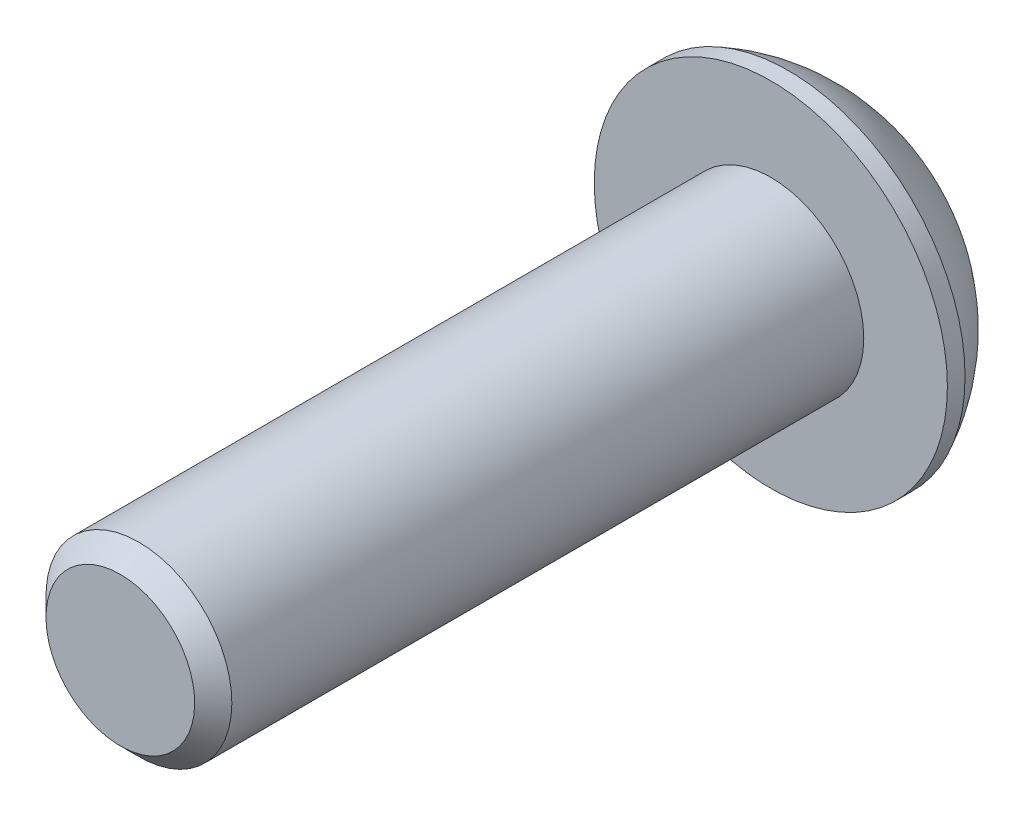
ISO-10303-21;
HEADER;
FILE_DESCRIPTION(('STEP AP214'),'2;1');
FILE_NAME('part.step','',(''),(''),'','','');
FILE_SCHEMA(('AUTOMOTIVE_DESIGN { 1 0 10303 214 1 1 1 1 }'));
ENDSEC;
DATA;
#1=APPLICATION_CONTEXT('core data for automotive mechanical design processes');
#2=APPLICATION_PROTOCOL_DEFINITION('international standard','automotive_design',2000,#1);
#3=PRODUCT_CONTEXT('',#1,'mechanical');
#4=PRODUCT('Part','Part','',(#3));
#5=PRODUCT_RELATED_PRODUCT_CATEGORY('part','',(#4));
#6=PRODUCT_DEFINITION_FORMATION('','',#4);
#7=PRODUCT_DEFINITION_CONTEXT('part definition',#1,'design');
#8=PRODUCT_DEFINITION('design','',#6,#7);
#9=PRODUCT_DEFINITION_SHAPE('','',#8);
#10=(LENGTH_UNIT() NAMED_UNIT(*) SI_UNIT(.MILLI.,.METRE.));
#11=(NAMED_UNIT(*) PLANE_ANGLE_UNIT() SI_UNIT($,.RADIAN.));
#12=(NAMED_UNIT(*) SI_UNIT($,.STERADIAN.) SOLID_ANGLE_UNIT());
#13=UNCERTAINTY_MEASURE_WITH_UNIT(LENGTH_MEASURE(1.E-05),#10,'distance_accuracy_value','');
#14=(GEOMETRIC_REPRESENTATION_CONTEXT(3) GLOBAL_UNCERTAINTY_ASSIGNED_CONTEXT((#13)) GLOBAL_UNIT_ASSIGNED_CONTEXT((#10,
#11,#12)) REPRESENTATION_CONTEXT('',''));
#15=CARTESIAN_POINT('',(0.,0.,0.));
#16=DIRECTION('',(0.,0.,1.));
#17=DIRECTION('',(1.,0.,0.));
#18=AXIS2_PLACEMENT_3D('',#15,#16,#17);
#19=CARTESIAN_POINT('',(0.,0.,-1.06));
#20=DIRECTION('',(0.,0.,1.));
#21=DIRECTION('',(1.,0.,0.));
#22=AXIS2_PLACEMENT_3D('',#19,#20,#21);
#23=PLANE('',#22);
#24=DIRECTION('',(-0.866025403784439,0.5,0.));
#25=VECTOR('',#24,1.);
#26=CARTESIAN_POINT('',(0.,1.44337567297406,-1.06));
#27=LINE('',#26,#25);
#28=CARTESIAN_POINT('',(0.,1.44337567297406,-1.06));
#29=VERTEX_POINT('',#28);
#30=CARTESIAN_POINT('',(1.25,0.721687836487031,-1.06));
#31=VERTEX_POINT('',#30);
#32=EDGE_CURVE('E70',#29,#31,#27,.F.);
#33=ORIENTED_EDGE('',*,*,#32,.T.);
#34=DIRECTION('',(0.,1.,0.));
#35=VECTOR('',#34,1.);
#36=CARTESIAN_POINT('',(1.25,0.721687836487032,-1.06));
#37=LINE('',#36,#35);
#38=CARTESIAN_POINT('',(1.25,-0.721687836487032,-1.06));
#39=VERTEX_POINT('',#38);
#40=EDGE_CURVE('E72',#31,#39,#37,.F.);
#41=ORIENTED_EDGE('',*,*,#40,.T.);
#42=DIRECTION('',(0.866025403784439,0.499999999999999,0.));
#43=VECTOR('',#42,1.);
#44=CARTESIAN_POINT('',(1.25,-0.721687836487032,-1.06));
#45=LINE('',#44,#43);
#46=CARTESIAN_POINT('',(0.,-1.44337567297406,-1.06));
#47=VERTEX_POINT('',#46);
#48=EDGE_CURVE('E125',#39,#47,#45,.F.);
#49=ORIENTED_EDGE('',*,*,#48,.T.);
#50=DIRECTION('',(0.866025403784438,-0.5,0.));
#51=VECTOR('',#50,1.);
#52=CARTESIAN_POINT('',(0.,-1.44337567297406,-1.06));
#53=LINE('',#52,#51);
#54=CARTESIAN_POINT('',(-1.25,-0.721687836487031,-1.06));
#55=VERTEX_POINT('',#54);
#56=EDGE_CURVE('E130',#47,#55,#53,.F.);
#57=ORIENTED_EDGE('',*,*,#56,.T.);
#58=DIRECTION('',(0.,1.,0.));
#59=VECTOR('',#58,1.);
#60=CARTESIAN_POINT('',(-1.25,-0.721687836487032,-1.06));
#61=LINE('',#60,#59);
#62=CARTESIAN_POINT('',(-1.25,0.721687836487032,-1.06));
#63=VERTEX_POINT('',#62);
#64=EDGE_CURVE('E134',#55,#63,#61,.T.);
#65=ORIENTED_EDGE('',*,*,#64,.T.);
#66=DIRECTION('',(-0.866025403784439,-0.5,0.));
#67=VECTOR('',#66,1.);
#68=CARTESIAN_POINT('',(-1.25,0.721687836487032,-1.06));
#69=LINE('',#68,#67);
#70=EDGE_CURVE('E68',#63,#29,#69,.F.);
#71=ORIENTED_EDGE('',*,*,#70,.T.);
#72=EDGE_LOOP('',(#33,#41,#49,#57,#65,#71));
#73=FACE_BOUND('',#72,.T.);
#74=ADVANCED_FACE('F17',(#73),#23,.F.);
#75=CARTESIAN_POINT('',(1.25,0.721687836487032,-2.2));
#76=DIRECTION('',(1.,0.,0.));
#77=DIRECTION('',(0.,0.,-1.));
#78=AXIS2_PLACEMENT_3D('',#75,#76,#77);
#79=PLANE('',#78);
#80=ORIENTED_EDGE('',*,*,#40,.F.);
#81=DIRECTION('',(0.,0.,1.));
#82=VECTOR('',#81,1.);
#83=CARTESIAN_POINT('',(1.25,0.721687836487029,-2.2));
#84=LINE('',#83,#82);
#85=CARTESIAN_POINT('',(1.25,0.721687836487031,-2.2));
#86=VERTEX_POINT('',#85);
#87=EDGE_CURVE('E77',#31,#86,#84,.F.);
#88=ORIENTED_EDGE('',*,*,#87,.T.);
#89=DIRECTION('',(0.,1.,0.));
#90=VECTOR('',#89,1.);
#91=CARTESIAN_POINT('',(1.25,-0.95,-2.2));
#92=LINE('',#91,#90);
#93=CARTESIAN_POINT('',(1.25,-0.721687836487032,-2.2));
#94=VERTEX_POINT('',#93);
#95=EDGE_CURVE('E122',#94,#86,#92,.T.);
#96=ORIENTED_EDGE('',*,*,#95,.F.);
#97=DIRECTION('',(0.,0.,1.));
#98=VECTOR('',#97,1.);
#99=CARTESIAN_POINT('',(1.25,-0.721687836487032,-2.2));
#100=LINE('',#99,#98);
#101=EDGE_CURVE('E83',#94,#39,#100,.T.);
#102=ORIENTED_EDGE('',*,*,#101,.T.);
#103=EDGE_LOOP('',(#80,#88,#96,#102));
#104=FACE_BOUND('',#103,.T.);
#105=ADVANCED_FACE('F80',(#104),#79,.F.);
#106=CARTESIAN_POINT('',(0.,1.44337567297406,-2.2));
#107=DIRECTION('',(0.5,0.866025403784439,0.));
#108=DIRECTION('',(-0.866025403784439,0.5,0.));
#109=AXIS2_PLACEMENT_3D('',#106,#107,#108);
#110=PLANE('',#109);
#111=ORIENTED_EDGE('',*,*,#32,.F.);
#112=DIRECTION('',(0.,0.,1.));
#113=VECTOR('',#112,1.);
#114=CARTESIAN_POINT('',(0.,1.44337567297406,-2.2));
#115=LINE('',#114,#113);
#116=CARTESIAN_POINT('',(0.,1.44337567297406,-2.2));
#117=VERTEX_POINT('',#116);
#118=EDGE_CURVE('E91',#29,#117,#115,.F.);
#119=ORIENTED_EDGE('',*,*,#118,.T.);
#120=DIRECTION('',(-0.86602540378444,0.499999999999998,0.));
#121=VECTOR('',#120,1.);
#122=CARTESIAN_POINT('',(1.25,0.721687836487032,-2.2));
#123=LINE('',#122,#121);
#124=EDGE_CURVE('E88',#86,#117,#123,.T.);
#125=ORIENTED_EDGE('',*,*,#124,.F.);
#126=ORIENTED_EDGE('',*,*,#87,.F.);
#127=EDGE_LOOP('',(#111,#119,#125,#126));
#128=FACE_BOUND('',#127,.T.);
#129=ADVANCED_FACE('F86',(#128),#110,.F.);
#130=CARTESIAN_POINT('',(-1.25,0.721687836487032,-2.2));
#131=DIRECTION('',(-0.5,0.866025403784439,0.));
#132=DIRECTION('',(-0.866025403784439,-0.5,0.));
#133=AXIS2_PLACEMENT_3D('',#130,#131,#132);
#134=PLANE('',#133);
#135=ORIENTED_EDGE('',*,*,#70,.F.);
#136=DIRECTION('',(0.,0.,1.));
#137=VECTOR('',#136,1.);
#138=CARTESIAN_POINT('',(-1.25,0.721687836487032,-2.2));
#139=LINE('',#138,#137);
#140=CARTESIAN_POINT('',(-1.25,0.721687836487032,-2.2));
#141=VERTEX_POINT('',#140);
#142=EDGE_CURVE('E132',#63,#141,#139,.F.);
#143=ORIENTED_EDGE('',*,*,#142,.T.);
#144=DIRECTION('',(-0.86602540378444,-0.499999999999998,0.));
#145=VECTOR('',#144,1.);
#146=CARTESIAN_POINT('',(0.,1.44337567297406,-2.2));
#147=LINE('',#146,#145);
#148=EDGE_CURVE('E118',#117,#141,#147,.T.);
#149=ORIENTED_EDGE('',*,*,#148,.F.);
#150=ORIENTED_EDGE('',*,*,#118,.F.);
#151=EDGE_LOOP('',(#135,#143,#149,#150));
#152=FACE_BOUND('',#151,.T.);
#153=ADVANCED_FACE('F137',(#152),#134,.F.);
#154=CARTESIAN_POINT('',(-1.25,-0.721687836487032,-2.2));
#155=DIRECTION('',(-1.,0.,0.));
#156=DIRECTION('',(0.,0.,1.));
#157=AXIS2_PLACEMENT_3D('',#154,#155,#156);
#158=PLANE('',#157);
#159=ORIENTED_EDGE('',*,*,#64,.F.);
#160=DIRECTION('',(0.,0.,1.));
#161=VECTOR('',#160,1.);
#162=CARTESIAN_POINT('',(-1.25,-0.721687836487029,-2.2));
#163=LINE('',#162,#161);
#164=CARTESIAN_POINT('',(-1.25,-0.721687836487031,-2.2));
#165=VERTEX_POINT('',#164);
#166=EDGE_CURVE('E128',#55,#165,#163,.F.);
#167=ORIENTED_EDGE('',*,*,#166,.T.);
#168=DIRECTION('',(0.,1.,0.));
#169=VECTOR('',#168,1.);
#170=CARTESIAN_POINT('',(-1.25,-0.95,-2.2));
#171=LINE('',#170,#169);
#172=EDGE_CURVE('E115',#141,#165,#171,.F.);
#173=ORIENTED_EDGE('',*,*,#172,.F.);
#174=ORIENTED_EDGE('',*,*,#142,.F.);
#175=EDGE_LOOP('',(#159,#167,#173,#174));
#176=FACE_BOUND('',#175,.T.);
#177=ADVANCED_FACE('F149',(#176),#158,.F.);
#178=CARTESIAN_POINT('',(0.,-1.44337567297406,-2.2));
#179=DIRECTION('',(-0.5,-0.866025403784438,0.));
#180=DIRECTION('',(0.866025403784438,-0.5,0.));
#181=AXIS2_PLACEMENT_3D('',#178,#179,#180);
#182=PLANE('',#181);
#183=ORIENTED_EDGE('',*,*,#56,.F.);
#184=DIRECTION('',(0.,0.,1.));
#185=VECTOR('',#184,1.);
#186=CARTESIAN_POINT('',(0.,-1.44337567297406,-2.2));
#187=LINE('',#186,#185);
#188=CARTESIAN_POINT('',(0.,-1.44337567297406,-2.2));
#189=VERTEX_POINT('',#188);
#190=EDGE_CURVE('E35',#47,#189,#187,.F.);
#191=ORIENTED_EDGE('',*,*,#190,.T.);
#192=DIRECTION('',(0.86602540378444,-0.499999999999998,0.));
#193=VECTOR('',#192,1.);
#194=CARTESIAN_POINT('',(-1.25,-0.721687836487032,-2.2));
#195=LINE('',#194,#193);
#196=EDGE_CURVE('E112',#165,#189,#195,.T.);
#197=ORIENTED_EDGE('',*,*,#196,.F.);
#198=ORIENTED_EDGE('',*,*,#166,.F.);
#199=EDGE_LOOP('',(#183,#191,#197,#198));
#200=FACE_BOUND('',#199,.T.);
#201=ADVANCED_FACE('F147',(#200),#182,.F.);
#202=CARTESIAN_POINT('',(1.25,-0.721687836487032,-2.2));
#203=DIRECTION('',(0.499999999999999,-0.866025403784439,0.));
#204=DIRECTION('',(0.866025403784439,0.499999999999999,0.));
#205=AXIS2_PLACEMENT_3D('',#202,#203,#204);
#206=PLANE('',#205);
#207=ORIENTED_EDGE('',*,*,#48,.F.);
#208=ORIENTED_EDGE('',*,*,#101,.F.);
#209=DIRECTION('',(0.86602540378444,0.499999999999998,0.));
#210=VECTOR('',#209,1.);
#211=CARTESIAN_POINT('',(0.,-1.44337567297406,-2.2));
#212=LINE('',#211,#210);
#213=EDGE_CURVE('E107',#189,#94,#212,.T.);
#214=ORIENTED_EDGE('',*,*,#213,.F.);
#215=ORIENTED_EDGE('',*,*,#190,.F.);
#216=EDGE_LOOP('',(#207,#208,#214,#215));
#217=FACE_BOUND('',#216,.T.);
#218=ADVANCED_FACE('F144',(#217),#206,.F.);
#219=CARTESIAN_POINT('',(0.,-0.95,-2.2));
#220=DIRECTION('',(0.,0.,-1.));
#221=DIRECTION('',(-1.,0.,0.));
#222=AXIS2_PLACEMENT_3D('',#219,#220,#221);
#223=PLANE('',#222);
#224=ORIENTED_EDGE('',*,*,#196,.T.);
#225=ORIENTED_EDGE('',*,*,#213,.T.);
#226=ORIENTED_EDGE('',*,*,#95,.T.);
#227=ORIENTED_EDGE('',*,*,#124,.T.);
#228=ORIENTED_EDGE('',*,*,#148,.T.);
#229=ORIENTED_EDGE('',*,*,#172,.T.);
#230=EDGE_LOOP('',(#224,#225,#226,#227,#228,#229));
#231=FACE_BOUND('',#230,.T.);
#232=CARTESIAN_POINT('',(0.,0.,-2.2));
#233=DIRECTION('',(0.,0.,-1.));
#234=DIRECTION('',(-1.,0.,0.));
#235=AXIS2_PLACEMENT_3D('',#232,#233,#234);
#236=CIRCLE('',#235,1.9);
#237=CARTESIAN_POINT('',(-1.9,0.,-2.2));
#238=VERTEX_POINT('',#237);
#239=EDGE_CURVE('E20',#238,#238,#236,.F.);
#240=ORIENTED_EDGE('',*,*,#239,.F.);
#241=EDGE_LOOP('',(#240));
#242=FACE_BOUND('',#241,.T.);
#243=ADVANCED_FACE('F141',(#231,#242),#223,.T.);
#244=CARTESIAN_POINT('',(0.,0.,1.35966483516485));
#245=DIRECTION('',(0.,0.,-1.));
#246=DIRECTION('',(0.,-1.,0.));
#247=AXIS2_PLACEMENT_3D('',#244,#245,#246);
#248=DEGENERATE_TOROIDAL_SURFACE('',#247,0.311899999999986,3.89785522418538,.T.);
#249=CARTESIAN_POINT('',(0.,0.,-0.380000000000001));
#250=DIRECTION('',(0.,0.,-1.));
#251=DIRECTION('',(-1.,0.,0.));
#252=AXIS2_PLACEMENT_3D('',#249,#250,#251);
#253=CIRCLE('',#252,3.8);
#254=CARTESIAN_POINT('',(-3.8,0.,-0.380000000000001));
#255=VERTEX_POINT('',#254);
#256=EDGE_CURVE('E99',#255,#255,#253,.F.);
#257=ORIENTED_EDGE('',*,*,#256,.F.);
#258=EDGE_LOOP('',(#257));
#259=FACE_BOUND('',#258,.T.);
#260=ORIENTED_EDGE('',*,*,#239,.T.);
#261=EDGE_LOOP('',(#260));
#262=FACE_BOUND('',#261,.T.);
#263=ADVANCED_FACE('F182',(#259,#262),#248,.T.);
#264=CARTESIAN_POINT('',(0.,0.,14.));
#265=DIRECTION('',(0.,0.,1.));
#266=DIRECTION('',(1.,0.,0.));
#267=AXIS2_PLACEMENT_3D('',#264,#265,#266);
#268=PLANE('',#267);
#269=CARTESIAN_POINT('',(0.,0.,13.9999999998963));
#270=DIRECTION('',(0.,0.,-1.));
#271=DIRECTION('',(0.,1.,0.));
#272=AXIS2_PLACEMENT_3D('',#269,#270,#271);
#273=CIRCLE('',#272,1.59999999999627);
#274=CARTESIAN_POINT('',(0.,1.59999999999627,13.9999999998963));
#275=VERTEX_POINT('',#274);
#276=EDGE_CURVE('E97',#275,#275,#273,.T.);
#277=ORIENTED_EDGE('',*,*,#276,.F.);
#278=EDGE_LOOP('',(#277));
#279=FACE_BOUND('',#278,.T.);
#280=ADVANCED_FACE('F178',(#279),#268,.T.);
#281=CARTESIAN_POINT('',(0.,0.,-0.19));
#282=DIRECTION('',(0.,0.,-1.));
#283=DIRECTION('',(-1.,0.,0.));
#284=AXIS2_PLACEMENT_3D('',#281,#282,#283);
#285=CYLINDRICAL_SURFACE('',#284,3.8);
#286=CARTESIAN_POINT('',(0.,0.,0.));
#287=DIRECTION('',(0.,0.,-1.));
#288=DIRECTION('',(-1.,0.,0.));
#289=AXIS2_PLACEMENT_3D('',#286,#287,#288);
#290=CIRCLE('',#289,3.8);
#291=CARTESIAN_POINT('',(-3.8,0.,0.));
#292=VERTEX_POINT('',#291);
#293=EDGE_CURVE('E95',#292,#292,#290,.T.);
#294=ORIENTED_EDGE('',*,*,#293,.T.);
#295=EDGE_LOOP('',(#294));
#296=FACE_BOUND('',#295,.T.);
#297=ORIENTED_EDGE('',*,*,#256,.T.);
#298=EDGE_LOOP('',(#297));
#299=FACE_BOUND('',#298,.T.);
#300=ADVANCED_FACE('F174',(#296,#299),#285,.T.);
#301=CARTESIAN_POINT('',(0.,0.,13.6000000000536));
#302=DIRECTION('',(0.,0.,-1.));
#303=DIRECTION('',(0.,1.,0.));
#304=AXIS2_PLACEMENT_3D('',#301,#302,#303);
#305=CONICAL_SURFACE('',#304,1.99999999989586,0.785398163468503);
#306=CARTESIAN_POINT('',(0.,0.,13.6));
#307=DIRECTION('',(0.,0.,1.));
#308=DIRECTION('',(1.,0.,0.));
#309=AXIS2_PLACEMENT_3D('',#306,#307,#308);
#310=CIRCLE('',#309,2.);
#311=CARTESIAN_POINT('',(2.,0.,13.6));
#312=VERTEX_POINT('',#311);
#313=EDGE_CURVE('E26',#312,#312,#310,.F.);
#314=ORIENTED_EDGE('',*,*,#313,.F.);
#315=EDGE_LOOP('',(#314));
#316=FACE_BOUND('',#315,.T.);
#317=ORIENTED_EDGE('',*,*,#276,.T.);
#318=EDGE_LOOP('',(#317));
#319=FACE_BOUND('',#318,.T.);
#320=ADVANCED_FACE('F167',(#316,#319),#305,.T.);
#321=CARTESIAN_POINT('',(0.,-1.9,0.));
#322=DIRECTION('',(0.,0.,-1.));
#323=DIRECTION('',(-1.,0.,0.));
#324=AXIS2_PLACEMENT_3D('',#321,#322,#323);
#325=PLANE('',#324);
#326=CARTESIAN_POINT('',(0.,0.,0.));
#327=DIRECTION('',(0.,0.,1.));
#328=DIRECTION('',(1.,0.,0.));
#329=AXIS2_PLACEMENT_3D('',#326,#327,#328);
#330=CIRCLE('',#329,2.);
#331=CARTESIAN_POINT('',(2.,0.,0.));
#332=VERTEX_POINT('',#331);
#333=EDGE_CURVE('E11',#332,#332,#330,.T.);
#334=ORIENTED_EDGE('',*,*,#333,.F.);
#335=EDGE_LOOP('',(#334));
#336=FACE_BOUND('',#335,.T.);
#337=ORIENTED_EDGE('',*,*,#293,.F.);
#338=EDGE_LOOP('',(#337));
#339=FACE_BOUND('',#338,.T.);
#340=ADVANCED_FACE('F161',(#336,#339),#325,.F.);
#341=CARTESIAN_POINT('',(0.,0.,0.));
#342=DIRECTION('',(0.,0.,1.));
#343=DIRECTION('',(1.,0.,0.));
#344=AXIS2_PLACEMENT_3D('',#341,#342,#343);
#345=CYLINDRICAL_SURFACE('',#344,2.);
#346=ORIENTED_EDGE('',*,*,#333,.T.);
#347=EDGE_LOOP('',(#346));
#348=FACE_BOUND('',#347,.T.);
#349=ORIENTED_EDGE('',*,*,#313,.T.);
#350=EDGE_LOOP('',(#349));
#351=FACE_BOUND('',#350,.T.);
#352=ADVANCED_FACE('F159',(#348,#351),#345,.T.);
#353=CLOSED_SHELL('',(#74,#105,#129,#153,#177,#201,#218,#243,#263,#280,#300,#320,#340,#352));
#354=MANIFOLD_SOLID_BREP('B1',#353);
#355=ADVANCED_BREP_SHAPE_REPRESENTATION('',(#18,#354),#14);
#356=SHAPE_DEFINITION_REPRESENTATION(#9,#355);
ENDSEC;
END-ISO-10303-21;
